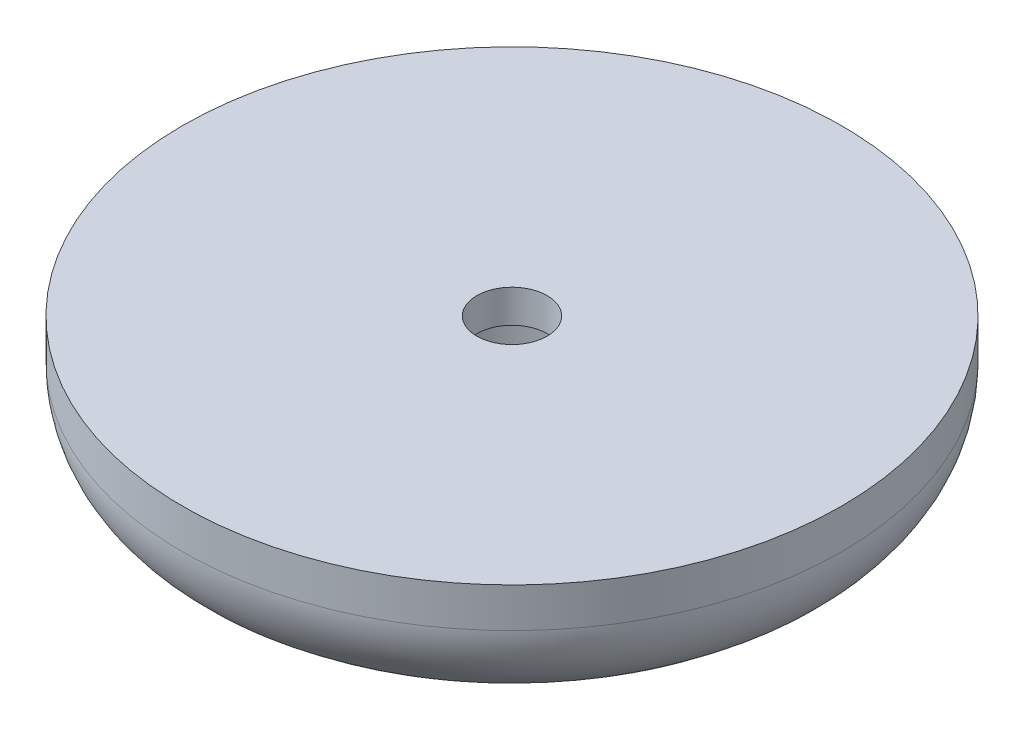
ISO-10303-21;
HEADER;
FILE_DESCRIPTION(('STEP AP214'),'2;1');
FILE_NAME('part.step','',(''),(''),'','','');
FILE_SCHEMA(('AUTOMOTIVE_DESIGN { 1 0 10303 214 1 1 1 1 }'));
ENDSEC;
DATA;
#1=APPLICATION_CONTEXT('core data for automotive mechanical design processes');
#2=APPLICATION_PROTOCOL_DEFINITION('international standard','automotive_design',2000,#1);
#3=PRODUCT_CONTEXT('',#1,'mechanical');
#4=PRODUCT('Part','Part','',(#3));
#5=PRODUCT_RELATED_PRODUCT_CATEGORY('part','',(#4));
#6=PRODUCT_DEFINITION_FORMATION('','',#4);
#7=PRODUCT_DEFINITION_CONTEXT('part definition',#1,'design');
#8=PRODUCT_DEFINITION('design','',#6,#7);
#9=PRODUCT_DEFINITION_SHAPE('','',#8);
#10=(LENGTH_UNIT() NAMED_UNIT(*) SI_UNIT(.MILLI.,.METRE.));
#11=(NAMED_UNIT(*) PLANE_ANGLE_UNIT() SI_UNIT($,.RADIAN.));
#12=(NAMED_UNIT(*) SI_UNIT($,.STERADIAN.) SOLID_ANGLE_UNIT());
#13=UNCERTAINTY_MEASURE_WITH_UNIT(LENGTH_MEASURE(1.E-05),#10,'distance_accuracy_value','');
#14=(GEOMETRIC_REPRESENTATION_CONTEXT(3) GLOBAL_UNCERTAINTY_ASSIGNED_CONTEXT((#13)) GLOBAL_UNIT_ASSIGNED_CONTEXT((#10,
#11,#12)) REPRESENTATION_CONTEXT('',''));
#15=CARTESIAN_POINT('',(0.,0.,0.));
#16=DIRECTION('',(0.,0.,1.));
#17=DIRECTION('',(1.,0.,0.));
#18=AXIS2_PLACEMENT_3D('',#15,#16,#17);
#19=CARTESIAN_POINT('',(0.,-5.8,0.));
#20=DIRECTION('',(0.,1.,0.));
#21=DIRECTION('',(-1.,0.,0.));
#22=AXIS2_PLACEMENT_3D('',#19,#20,#21);
#23=PLANE('',#22);
#24=CARTESIAN_POINT('',(0.,-5.8,0.));
#25=DIRECTION('',(0.,1.,0.));
#26=DIRECTION('',(-1.,0.,0.));
#27=AXIS2_PLACEMENT_3D('',#24,#25,#26);
#28=CIRCLE('',#27,5.);
#29=CARTESIAN_POINT('',(-5.,-5.8,0.));
#30=VERTEX_POINT('',#29);
#31=EDGE_CURVE('E10',#30,#30,#28,.T.);
#32=ORIENTED_EDGE('',*,*,#31,.T.);
#33=EDGE_LOOP('',(#32));
#34=FACE_BOUND('',#33,.T.);
#35=CARTESIAN_POINT('',(0.,-5.8,0.));
#36=DIRECTION('',(0.,1.,0.));
#37=DIRECTION('',(-1.,0.,0.));
#38=AXIS2_PLACEMENT_3D('',#35,#36,#37);
#39=CIRCLE('',#38,11.);
#40=CARTESIAN_POINT('',(-11.,-5.8,0.));
#41=VERTEX_POINT('',#40);
#42=EDGE_CURVE('E42',#41,#41,#39,.F.);
#43=ORIENTED_EDGE('',*,*,#42,.T.);
#44=EDGE_LOOP('',(#43));
#45=FACE_BOUND('',#44,.T.);
#46=ADVANCED_FACE('F31',(#34,#45),#23,.F.);
#47=CARTESIAN_POINT('',(0.,0.,0.));
#48=DIRECTION('',(0.,1.,0.));
#49=DIRECTION('',(-1.,0.,0.));
#50=AXIS2_PLACEMENT_3D('',#47,#48,#49);
#51=CYLINDRICAL_SURFACE('',#50,15.);
#52=CARTESIAN_POINT('',(0.,-1.8,0.));
#53=DIRECTION('',(0.,1.,0.));
#54=DIRECTION('',(-1.,0.,0.));
#55=AXIS2_PLACEMENT_3D('',#52,#53,#54);
#56=CIRCLE('',#55,15.);
#57=CARTESIAN_POINT('',(-15.,-1.8,0.));
#58=VERTEX_POINT('',#57);
#59=EDGE_CURVE('E46',#58,#58,#56,.T.);
#60=ORIENTED_EDGE('',*,*,#59,.T.);
#61=EDGE_LOOP('',(#60));
#62=FACE_BOUND('',#61,.T.);
#63=CARTESIAN_POINT('',(0.,0.,0.));
#64=DIRECTION('',(0.,1.,0.));
#65=DIRECTION('',(-1.,0.,0.));
#66=AXIS2_PLACEMENT_3D('',#63,#64,#65);
#67=CIRCLE('',#66,15.);
#68=CARTESIAN_POINT('',(-15.,0.,0.));
#69=VERTEX_POINT('',#68);
#70=EDGE_CURVE('E51',#69,#69,#67,.T.);
#71=ORIENTED_EDGE('',*,*,#70,.F.);
#72=EDGE_LOOP('',(#71));
#73=FACE_BOUND('',#72,.T.);
#74=ADVANCED_FACE('F79',(#62,#73),#51,.T.);
#75=CARTESIAN_POINT('',(0.,0.,0.));
#76=DIRECTION('',(0.,-1.,0.));
#77=DIRECTION('',(1.,0.,0.));
#78=AXIS2_PLACEMENT_3D('',#75,#76,#77);
#79=PLANE('',#78);
#80=CARTESIAN_POINT('',(0.,0.,0.));
#81=DIRECTION('',(0.,-1.,0.));
#82=DIRECTION('',(0.,0.,-1.));
#83=AXIS2_PLACEMENT_3D('',#80,#81,#82);
#84=CIRCLE('',#83,1.6);
#85=CARTESIAN_POINT('',(0.,0.,-1.6));
#86=VERTEX_POINT('',#85);
#87=EDGE_CURVE('E54',#86,#86,#84,.T.);
#88=ORIENTED_EDGE('',*,*,#87,.T.);
#89=EDGE_LOOP('',(#88));
#90=FACE_BOUND('',#89,.T.);
#91=ORIENTED_EDGE('',*,*,#70,.T.);
#92=EDGE_LOOP('',(#91));
#93=FACE_BOUND('',#92,.T.);
#94=ADVANCED_FACE('F84',(#90,#93),#79,.F.);
#95=CARTESIAN_POINT('',(0.,-5.8,0.));
#96=DIRECTION('',(0.,-1.,0.));
#97=DIRECTION('',(0.,0.,-1.));
#98=AXIS2_PLACEMENT_3D('',#95,#96,#97);
#99=CYLINDRICAL_SURFACE('',#98,1.6);
#100=ORIENTED_EDGE('',*,*,#87,.F.);
#101=EDGE_LOOP('',(#100));
#102=FACE_BOUND('',#101,.T.);
#103=CARTESIAN_POINT('',(0.,-1.5,0.));
#104=DIRECTION('',(0.,-1.,0.));
#105=DIRECTION('',(0.,0.,-1.));
#106=AXIS2_PLACEMENT_3D('',#103,#104,#105);
#107=CIRCLE('',#106,1.6);
#108=CARTESIAN_POINT('',(0.,-1.5,-1.6));
#109=VERTEX_POINT('',#108);
#110=EDGE_CURVE('E57',#109,#109,#107,.T.);
#111=ORIENTED_EDGE('',*,*,#110,.T.);
#112=EDGE_LOOP('',(#111));
#113=FACE_BOUND('',#112,.T.);
#114=ADVANCED_FACE('F75',(#102,#113),#99,.F.);
#115=CARTESIAN_POINT('',(1.6,-1.5,0.));
#116=DIRECTION('',(0.,1.,0.));
#117=DIRECTION('',(0.,0.,1.));
#118=AXIS2_PLACEMENT_3D('',#115,#116,#117);
#119=PLANE('',#118);
#120=ORIENTED_EDGE('',*,*,#110,.F.);
#121=EDGE_LOOP('',(#120));
#122=FACE_BOUND('',#121,.T.);
#123=CARTESIAN_POINT('',(0.,-1.5,0.));
#124=DIRECTION('',(0.,-1.,0.));
#125=DIRECTION('',(0.,0.,-1.));
#126=AXIS2_PLACEMENT_3D('',#123,#124,#125);
#127=CIRCLE('',#126,4.);
#128=CARTESIAN_POINT('',(0.,-1.5,-4.));
#129=VERTEX_POINT('',#128);
#130=EDGE_CURVE('E60',#129,#129,#127,.T.);
#131=ORIENTED_EDGE('',*,*,#130,.T.);
#132=EDGE_LOOP('',(#131));
#133=FACE_BOUND('',#132,.T.);
#134=ADVANCED_FACE('F64',(#122,#133),#119,.F.);
#135=CARTESIAN_POINT('',(0.,-5.8,0.));
#136=DIRECTION('',(0.,-1.,0.));
#137=DIRECTION('',(0.,0.,-1.));
#138=AXIS2_PLACEMENT_3D('',#135,#136,#137);
#139=CYLINDRICAL_SURFACE('',#138,4.);
#140=CARTESIAN_POINT('',(0.,-4.8,0.));
#141=DIRECTION('',(0.,1.,0.));
#142=DIRECTION('',(-1.,0.,0.));
#143=AXIS2_PLACEMENT_3D('',#140,#141,#142);
#144=CIRCLE('',#143,4.);
#145=CARTESIAN_POINT('',(-4.,-4.8,0.));
#146=VERTEX_POINT('',#145);
#147=EDGE_CURVE('E38',#146,#146,#144,.F.);
#148=ORIENTED_EDGE('',*,*,#147,.T.);
#149=EDGE_LOOP('',(#148));
#150=FACE_BOUND('',#149,.T.);
#151=ORIENTED_EDGE('',*,*,#130,.F.);
#152=EDGE_LOOP('',(#151));
#153=FACE_BOUND('',#152,.T.);
#154=ADVANCED_FACE('F66',(#150,#153),#139,.F.);
#155=CARTESIAN_POINT('',(0.,-1.8,0.));
#156=DIRECTION('',(0.,1.,0.));
#157=DIRECTION('',(-1.,0.,0.));
#158=AXIS2_PLACEMENT_3D('',#155,#156,#157);
#159=TOROIDAL_SURFACE('',#158,11.,4.);
#160=ORIENTED_EDGE('',*,*,#42,.F.);
#161=EDGE_LOOP('',(#160));
#162=FACE_BOUND('',#161,.T.);
#163=ORIENTED_EDGE('',*,*,#59,.F.);
#164=EDGE_LOOP('',(#163));
#165=FACE_BOUND('',#164,.T.);
#166=ADVANCED_FACE('F68',(#162,#165),#159,.T.);
#167=CARTESIAN_POINT('',(0.,-4.8,0.));
#168=DIRECTION('',(0.,1.,0.));
#169=DIRECTION('',(-1.,0.,0.));
#170=AXIS2_PLACEMENT_3D('',#167,#168,#169);
#171=TOROIDAL_SURFACE('',#170,5.,1.);
#172=ORIENTED_EDGE('',*,*,#31,.F.);
#173=EDGE_LOOP('',(#172));
#174=FACE_BOUND('',#173,.T.);
#175=ORIENTED_EDGE('',*,*,#147,.F.);
#176=EDGE_LOOP('',(#175));
#177=FACE_BOUND('',#176,.T.);
#178=ADVANCED_FACE('F33',(#174,#177),#171,.T.);
#179=CLOSED_SHELL('',(#46,#74,#94,#114,#134,#154,#166,#178));
#180=MANIFOLD_SOLID_BREP('B2',#179);
#181=ADVANCED_BREP_SHAPE_REPRESENTATION('',(#18,#180),#14);
#182=SHAPE_DEFINITION_REPRESENTATION(#9,#181);
ENDSEC;
END-ISO-10303-21;
